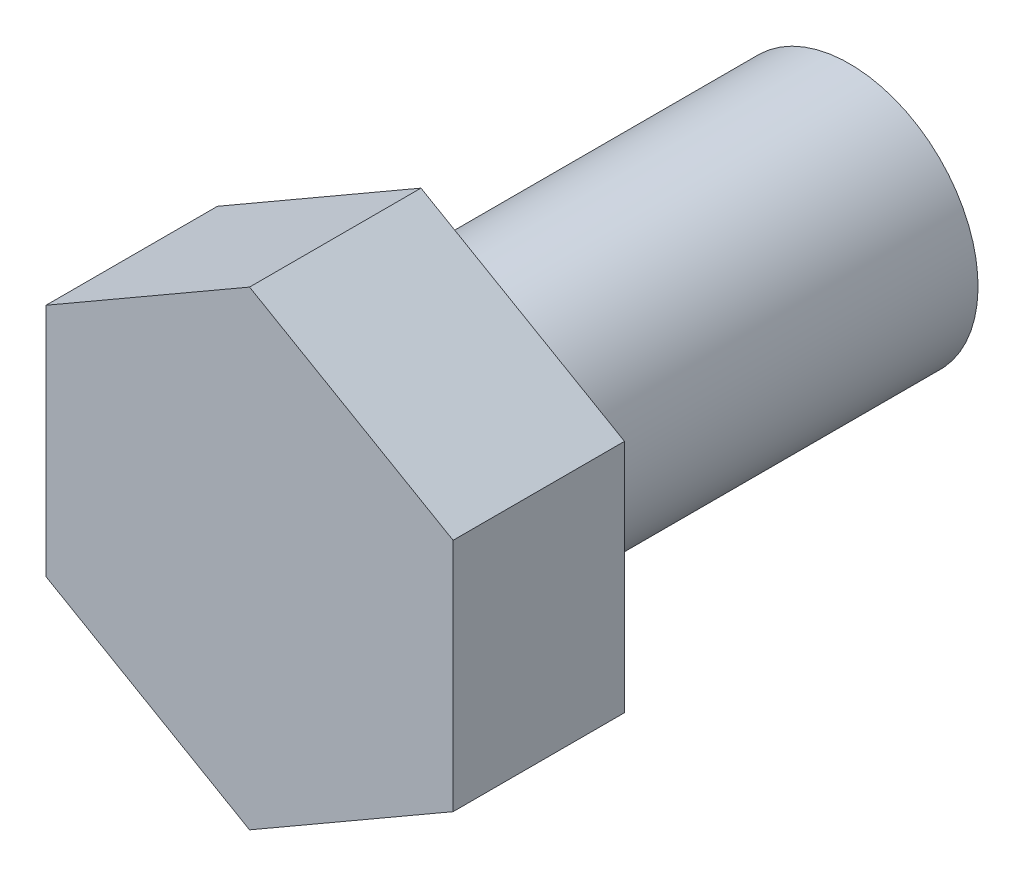
ISO-10303-21;
HEADER;
FILE_DESCRIPTION(('STEP AP214'),'2;1');
FILE_NAME('part.step','',(''),(''),'','','');
FILE_SCHEMA(('AUTOMOTIVE_DESIGN { 1 0 10303 214 1 1 1 1 }'));
ENDSEC;
DATA;
#1=APPLICATION_CONTEXT('core data for automotive mechanical design processes');
#2=APPLICATION_PROTOCOL_DEFINITION('international standard','automotive_design',2000,#1);
#3=PRODUCT_CONTEXT('',#1,'mechanical');
#4=PRODUCT('Part','Part','',(#3));
#5=PRODUCT_RELATED_PRODUCT_CATEGORY('part','',(#4));
#6=PRODUCT_DEFINITION_FORMATION('','',#4);
#7=PRODUCT_DEFINITION_CONTEXT('part definition',#1,'design');
#8=PRODUCT_DEFINITION('design','',#6,#7);
#9=PRODUCT_DEFINITION_SHAPE('','',#8);
#10=(LENGTH_UNIT() NAMED_UNIT(*) SI_UNIT(.MILLI.,.METRE.));
#11=(NAMED_UNIT(*) PLANE_ANGLE_UNIT() SI_UNIT($,.RADIAN.));
#12=(NAMED_UNIT(*) SI_UNIT($,.STERADIAN.) SOLID_ANGLE_UNIT());
#13=UNCERTAINTY_MEASURE_WITH_UNIT(LENGTH_MEASURE(1.E-05),#10,'distance_accuracy_value','');
#14=(GEOMETRIC_REPRESENTATION_CONTEXT(3) GLOBAL_UNCERTAINTY_ASSIGNED_CONTEXT((#13)) GLOBAL_UNIT_ASSIGNED_CONTEXT((#10,
#11,#12)) REPRESENTATION_CONTEXT('',''));
#15=CARTESIAN_POINT('',(0.,0.,0.));
#16=DIRECTION('',(0.,0.,1.));
#17=DIRECTION('',(1.,0.,0.));
#18=AXIS2_PLACEMENT_3D('',#15,#16,#17);
#19=CARTESIAN_POINT('',(9.5,-5.48482755730144,8.));
#20=DIRECTION('',(-1.,0.,0.));
#21=DIRECTION('',(0.,0.,1.));
#22=AXIS2_PLACEMENT_3D('',#19,#20,#21);
#23=PLANE('',#22);
#24=DIRECTION('',(0.,1.,0.));
#25=VECTOR('',#24,1.);
#26=CARTESIAN_POINT('',(9.5,-5.48482755730144,0.));
#27=LINE('',#26,#25);
#28=CARTESIAN_POINT('',(9.5,-5.48482755730144,0.));
#29=VERTEX_POINT('',#28);
#30=CARTESIAN_POINT('',(9.5,5.48482755730145,0.));
#31=VERTEX_POINT('',#30);
#32=EDGE_CURVE('E125',#29,#31,#27,.T.);
#33=ORIENTED_EDGE('',*,*,#32,.T.);
#34=DIRECTION('',(0.,0.,-1.));
#35=VECTOR('',#34,1.);
#36=CARTESIAN_POINT('',(9.5,5.48482755730145,8.));
#37=LINE('',#36,#35);
#38=CARTESIAN_POINT('',(9.5,5.48482755730145,8.));
#39=VERTEX_POINT('',#38);
#40=EDGE_CURVE('E11',#39,#31,#37,.T.);
#41=ORIENTED_EDGE('',*,*,#40,.F.);
#42=DIRECTION('',(0.,1.,0.));
#43=VECTOR('',#42,1.);
#44=CARTESIAN_POINT('',(9.5,-5.48482755730144,8.));
#45=LINE('',#44,#43);
#46=CARTESIAN_POINT('',(9.5,-5.48482755730144,8.));
#47=VERTEX_POINT('',#46);
#48=EDGE_CURVE('E136',#47,#39,#45,.T.);
#49=ORIENTED_EDGE('',*,*,#48,.F.);
#50=DIRECTION('',(0.,0.,-1.));
#51=VECTOR('',#50,1.);
#52=CARTESIAN_POINT('',(9.5,-5.48482755730144,8.));
#53=LINE('',#52,#51);
#54=EDGE_CURVE('E121',#47,#29,#53,.T.);
#55=ORIENTED_EDGE('',*,*,#54,.T.);
#56=EDGE_LOOP('',(#33,#41,#49,#55));
#57=FACE_BOUND('',#56,.T.);
#58=ADVANCED_FACE('F41',(#57),#23,.F.);
#59=CARTESIAN_POINT('',(9.5,5.48482755730145,8.));
#60=DIRECTION('',(-0.5,-0.866025403784439,0.));
#61=DIRECTION('',(0.866025403784439,-0.5,0.));
#62=AXIS2_PLACEMENT_3D('',#59,#60,#61);
#63=PLANE('',#62);
#64=DIRECTION('',(-0.866025403784439,0.5,0.));
#65=VECTOR('',#64,1.);
#66=CARTESIAN_POINT('',(9.5,5.48482755730145,0.));
#67=LINE('',#66,#65);
#68=CARTESIAN_POINT('',(0.,10.9696551146029,0.));
#69=VERTEX_POINT('',#68);
#70=EDGE_CURVE('E128',#31,#69,#67,.T.);
#71=ORIENTED_EDGE('',*,*,#70,.T.);
#72=DIRECTION('',(0.,0.,-1.));
#73=VECTOR('',#72,1.);
#74=CARTESIAN_POINT('',(0.,10.9696551146029,8.));
#75=LINE('',#74,#73);
#76=CARTESIAN_POINT('',(0.,10.9696551146029,8.));
#77=VERTEX_POINT('',#76);
#78=EDGE_CURVE('E49',#77,#69,#75,.T.);
#79=ORIENTED_EDGE('',*,*,#78,.F.);
#80=DIRECTION('',(-0.866025403784439,0.5,0.));
#81=VECTOR('',#80,1.);
#82=CARTESIAN_POINT('',(9.5,5.48482755730145,8.));
#83=LINE('',#82,#81);
#84=EDGE_CURVE('E94',#39,#77,#83,.T.);
#85=ORIENTED_EDGE('',*,*,#84,.F.);
#86=ORIENTED_EDGE('',*,*,#40,.T.);
#87=EDGE_LOOP('',(#71,#79,#85,#86));
#88=FACE_BOUND('',#87,.T.);
#89=ADVANCED_FACE('F160',(#88),#63,.F.);
#90=CARTESIAN_POINT('',(0.,10.9696551146029,8.));
#91=DIRECTION('',(0.5,-0.866025403784439,0.));
#92=DIRECTION('',(0.866025403784439,0.5,0.));
#93=AXIS2_PLACEMENT_3D('',#90,#91,#92);
#94=PLANE('',#93);
#95=DIRECTION('',(-0.866025403784439,-0.5,0.));
#96=VECTOR('',#95,1.);
#97=CARTESIAN_POINT('',(0.,10.9696551146029,0.));
#98=LINE('',#97,#96);
#99=CARTESIAN_POINT('',(-9.5,5.48482755730144,0.));
#100=VERTEX_POINT('',#99);
#101=EDGE_CURVE('E131',#69,#100,#98,.T.);
#102=ORIENTED_EDGE('',*,*,#101,.T.);
#103=DIRECTION('',(0.,0.,-1.));
#104=VECTOR('',#103,1.);
#105=CARTESIAN_POINT('',(-9.5,5.48482755730144,8.));
#106=LINE('',#105,#104);
#107=CARTESIAN_POINT('',(-9.5,5.48482755730144,8.));
#108=VERTEX_POINT('',#107);
#109=EDGE_CURVE('E116',#108,#100,#106,.T.);
#110=ORIENTED_EDGE('',*,*,#109,.F.);
#111=DIRECTION('',(-0.866025403784439,-0.5,0.));
#112=VECTOR('',#111,1.);
#113=CARTESIAN_POINT('',(0.,10.9696551146029,8.));
#114=LINE('',#113,#112);
#115=EDGE_CURVE('E107',#77,#108,#114,.T.);
#116=ORIENTED_EDGE('',*,*,#115,.F.);
#117=ORIENTED_EDGE('',*,*,#78,.T.);
#118=EDGE_LOOP('',(#102,#110,#116,#117));
#119=FACE_BOUND('',#118,.T.);
#120=ADVANCED_FACE('F142',(#119),#94,.F.);
#121=CARTESIAN_POINT('',(-9.5,5.48482755730144,8.));
#122=DIRECTION('',(1.,0.,0.));
#123=DIRECTION('',(0.,0.,-1.));
#124=AXIS2_PLACEMENT_3D('',#121,#122,#123);
#125=PLANE('',#124);
#126=DIRECTION('',(0.,-1.,0.));
#127=VECTOR('',#126,1.);
#128=CARTESIAN_POINT('',(-9.5,5.48482755730144,0.));
#129=LINE('',#128,#127);
#130=CARTESIAN_POINT('',(-9.5,-5.48482755730144,0.));
#131=VERTEX_POINT('',#130);
#132=EDGE_CURVE('E115',#100,#131,#129,.T.);
#133=ORIENTED_EDGE('',*,*,#132,.T.);
#134=DIRECTION('',(0.,0.,-1.));
#135=VECTOR('',#134,1.);
#136=CARTESIAN_POINT('',(-9.5,-5.48482755730144,8.));
#137=LINE('',#136,#135);
#138=CARTESIAN_POINT('',(-9.5,-5.48482755730144,8.));
#139=VERTEX_POINT('',#138);
#140=EDGE_CURVE('E112',#139,#131,#137,.T.);
#141=ORIENTED_EDGE('',*,*,#140,.F.);
#142=DIRECTION('',(0.,-1.,0.));
#143=VECTOR('',#142,1.);
#144=CARTESIAN_POINT('',(-9.5,5.48482755730144,8.));
#145=LINE('',#144,#143);
#146=EDGE_CURVE('E101',#108,#139,#145,.T.);
#147=ORIENTED_EDGE('',*,*,#146,.F.);
#148=ORIENTED_EDGE('',*,*,#109,.T.);
#149=EDGE_LOOP('',(#133,#141,#147,#148));
#150=FACE_BOUND('',#149,.T.);
#151=ADVANCED_FACE('F113',(#150),#125,.F.);
#152=CARTESIAN_POINT('',(-9.5,-5.48482755730144,8.));
#153=DIRECTION('',(0.5,0.866025403784439,0.));
#154=DIRECTION('',(-0.866025403784439,0.5,0.));
#155=AXIS2_PLACEMENT_3D('',#152,#153,#154);
#156=PLANE('',#155);
#157=DIRECTION('',(0.866025403784439,-0.5,0.));
#158=VECTOR('',#157,1.);
#159=CARTESIAN_POINT('',(-9.5,-5.48482755730144,0.));
#160=LINE('',#159,#158);
#161=CARTESIAN_POINT('',(0.,-10.9696551146029,0.));
#162=VERTEX_POINT('',#161);
#163=EDGE_CURVE('E80',#131,#162,#160,.T.);
#164=ORIENTED_EDGE('',*,*,#163,.T.);
#165=DIRECTION('',(0.,0.,-1.));
#166=VECTOR('',#165,1.);
#167=CARTESIAN_POINT('',(0.,-10.9696551146029,8.));
#168=LINE('',#167,#166);
#169=CARTESIAN_POINT('',(0.,-10.9696551146029,8.));
#170=VERTEX_POINT('',#169);
#171=EDGE_CURVE('E117',#170,#162,#168,.T.);
#172=ORIENTED_EDGE('',*,*,#171,.F.);
#173=DIRECTION('',(0.866025403784439,-0.5,0.));
#174=VECTOR('',#173,1.);
#175=CARTESIAN_POINT('',(-9.5,-5.48482755730144,8.));
#176=LINE('',#175,#174);
#177=EDGE_CURVE('E105',#139,#170,#176,.T.);
#178=ORIENTED_EDGE('',*,*,#177,.F.);
#179=ORIENTED_EDGE('',*,*,#140,.T.);
#180=EDGE_LOOP('',(#164,#172,#178,#179));
#181=FACE_BOUND('',#180,.T.);
#182=ADVANCED_FACE('F119',(#181),#156,.F.);
#183=CARTESIAN_POINT('',(0.,-10.9696551146029,8.));
#184=DIRECTION('',(-0.5,0.866025403784439,0.));
#185=DIRECTION('',(-0.866025403784439,-0.5,0.));
#186=AXIS2_PLACEMENT_3D('',#183,#184,#185);
#187=PLANE('',#186);
#188=DIRECTION('',(0.866025403784439,0.5,0.));
#189=VECTOR('',#188,1.);
#190=CARTESIAN_POINT('',(0.,-10.9696551146029,0.));
#191=LINE('',#190,#189);
#192=EDGE_CURVE('E86',#162,#29,#191,.T.);
#193=ORIENTED_EDGE('',*,*,#192,.T.);
#194=ORIENTED_EDGE('',*,*,#54,.F.);
#195=DIRECTION('',(0.866025403784439,0.5,0.));
#196=VECTOR('',#195,1.);
#197=CARTESIAN_POINT('',(0.,-10.9696551146029,8.));
#198=LINE('',#197,#196);
#199=EDGE_CURVE('E57',#170,#47,#198,.T.);
#200=ORIENTED_EDGE('',*,*,#199,.F.);
#201=ORIENTED_EDGE('',*,*,#171,.T.);
#202=EDGE_LOOP('',(#193,#194,#200,#201));
#203=FACE_BOUND('',#202,.T.);
#204=ADVANCED_FACE('F149',(#203),#187,.F.);
#205=CARTESIAN_POINT('',(0.,0.,8.));
#206=DIRECTION('',(0.,0.,1.));
#207=DIRECTION('',(1.,0.,0.));
#208=AXIS2_PLACEMENT_3D('',#205,#206,#207);
#209=PLANE('',#208);
#210=ORIENTED_EDGE('',*,*,#48,.T.);
#211=ORIENTED_EDGE('',*,*,#84,.T.);
#212=ORIENTED_EDGE('',*,*,#115,.T.);
#213=ORIENTED_EDGE('',*,*,#146,.T.);
#214=ORIENTED_EDGE('',*,*,#177,.T.);
#215=ORIENTED_EDGE('',*,*,#199,.T.);
#216=EDGE_LOOP('',(#210,#211,#212,#213,#214,#215));
#217=FACE_BOUND('',#216,.T.);
#218=ADVANCED_FACE('F103',(#217),#209,.T.);
#219=CARTESIAN_POINT('',(0.,0.,0.));
#220=DIRECTION('',(0.,0.,1.));
#221=DIRECTION('',(1.,0.,0.));
#222=AXIS2_PLACEMENT_3D('',#219,#220,#221);
#223=PLANE('',#222);
#224=CARTESIAN_POINT('',(0.,0.,0.));
#225=DIRECTION('',(0.,0.,1.));
#226=DIRECTION('',(0.,-1.,0.));
#227=AXIS2_PLACEMENT_3D('',#224,#225,#226);
#228=CIRCLE('',#227,6.);
#229=CARTESIAN_POINT('',(0.,-6.,0.));
#230=VERTEX_POINT('',#229);
#231=EDGE_CURVE('E129',#230,#230,#228,.T.);
#232=ORIENTED_EDGE('',*,*,#231,.T.);
#233=EDGE_LOOP('',(#232));
#234=FACE_BOUND('',#233,.T.);
#235=ORIENTED_EDGE('',*,*,#32,.F.);
#236=ORIENTED_EDGE('',*,*,#192,.F.);
#237=ORIENTED_EDGE('',*,*,#163,.F.);
#238=ORIENTED_EDGE('',*,*,#132,.F.);
#239=ORIENTED_EDGE('',*,*,#101,.F.);
#240=ORIENTED_EDGE('',*,*,#70,.F.);
#241=EDGE_LOOP('',(#235,#236,#237,#238,#239,#240));
#242=FACE_BOUND('',#241,.T.);
#243=ADVANCED_FACE('F145',(#234,#242),#223,.F.);
#244=CARTESIAN_POINT('',(0.,0.,-20.));
#245=DIRECTION('',(0.,0.,1.));
#246=DIRECTION('',(0.,-1.,0.));
#247=AXIS2_PLACEMENT_3D('',#244,#245,#246);
#248=PLANE('',#247);
#249=CARTESIAN_POINT('',(0.,0.,-20.));
#250=DIRECTION('',(0.,0.,1.));
#251=DIRECTION('',(0.,-1.,0.));
#252=AXIS2_PLACEMENT_3D('',#249,#250,#251);
#253=CIRCLE('',#252,6.);
#254=CARTESIAN_POINT('',(0.,-6.,-20.));
#255=VERTEX_POINT('',#254);
#256=EDGE_CURVE('E224',#255,#255,#253,.T.);
#257=ORIENTED_EDGE('',*,*,#256,.F.);
#258=EDGE_LOOP('',(#257));
#259=FACE_BOUND('',#258,.T.);
#260=ADVANCED_FACE('F199',(#259),#248,.F.);
#261=CARTESIAN_POINT('',(0.,0.,0.));
#262=DIRECTION('',(0.,0.,1.));
#263=DIRECTION('',(0.,-1.,0.));
#264=AXIS2_PLACEMENT_3D('',#261,#262,#263);
#265=CYLINDRICAL_SURFACE('',#264,6.);
#266=ORIENTED_EDGE('',*,*,#256,.T.);
#267=EDGE_LOOP('',(#266));
#268=FACE_BOUND('',#267,.T.);
#269=ORIENTED_EDGE('',*,*,#231,.F.);
#270=EDGE_LOOP('',(#269));
#271=FACE_BOUND('',#270,.T.);
#272=ADVANCED_FACE('F208',(#268,#271),#265,.T.);
#273=CLOSED_SHELL('',(#58,#89,#120,#151,#182,#204,#218,#243,#260,#272));
#274=MANIFOLD_SOLID_BREP('B2',#273);
#275=ADVANCED_BREP_SHAPE_REPRESENTATION('',(#18,#274),#14);
#276=SHAPE_DEFINITION_REPRESENTATION(#9,#275);
ENDSEC;
END-ISO-10303-21;
